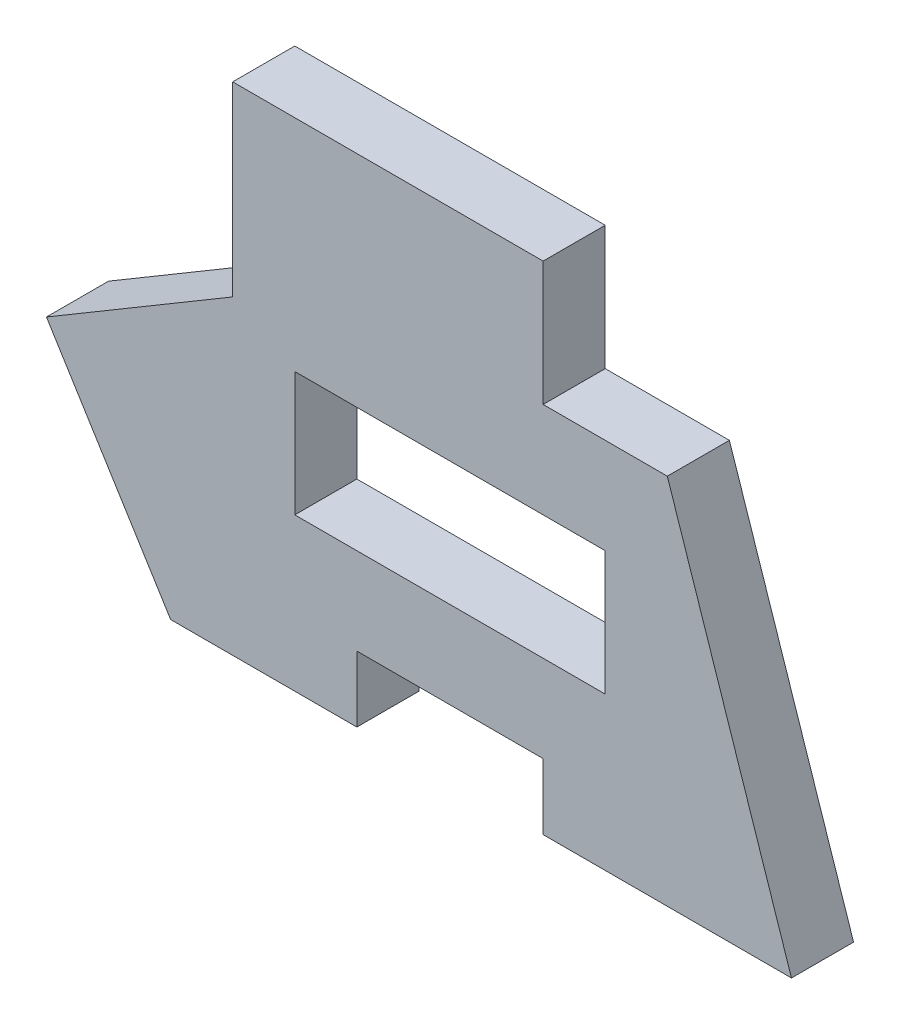
ISO-10303-21;
HEADER;
FILE_DESCRIPTION(('STEP AP214'),'2;1');
FILE_NAME('part.step','',(''),(''),'','','');
FILE_SCHEMA(('AUTOMOTIVE_DESIGN { 1 0 10303 214 1 1 1 1 }'));
ENDSEC;
DATA;
#1=APPLICATION_CONTEXT('core data for automotive mechanical design processes');
#2=APPLICATION_PROTOCOL_DEFINITION('international standard','automotive_design',2000,#1);
#3=PRODUCT_CONTEXT('',#1,'mechanical');
#4=PRODUCT('Part','Part','',(#3));
#5=PRODUCT_RELATED_PRODUCT_CATEGORY('part','',(#4));
#6=PRODUCT_DEFINITION_FORMATION('','',#4);
#7=PRODUCT_DEFINITION_CONTEXT('part definition',#1,'design');
#8=PRODUCT_DEFINITION('design','',#6,#7);
#9=PRODUCT_DEFINITION_SHAPE('','',#8);
#10=(LENGTH_UNIT() NAMED_UNIT(*) SI_UNIT(.MILLI.,.METRE.));
#11=(NAMED_UNIT(*) PLANE_ANGLE_UNIT() SI_UNIT($,.RADIAN.));
#12=(NAMED_UNIT(*) SI_UNIT($,.STERADIAN.) SOLID_ANGLE_UNIT());
#13=UNCERTAINTY_MEASURE_WITH_UNIT(LENGTH_MEASURE(1.E-05),#10,'distance_accuracy_value','');
#14=(GEOMETRIC_REPRESENTATION_CONTEXT(3) GLOBAL_UNCERTAINTY_ASSIGNED_CONTEXT((#13)) GLOBAL_UNIT_ASSIGNED_CONTEXT((#10,
#11,#12)) REPRESENTATION_CONTEXT('',''));
#15=CARTESIAN_POINT('',(0.,0.,0.));
#16=DIRECTION('',(0.,0.,1.));
#17=DIRECTION('',(1.,0.,0.));
#18=AXIS2_PLACEMENT_3D('',#15,#16,#17);
#19=CARTESIAN_POINT('',(0.,0.,50.));
#20=DIRECTION('',(0.,0.,-1.));
#21=DIRECTION('',(-1.,0.,0.));
#22=AXIS2_PLACEMENT_3D('',#19,#20,#21);
#23=PLANE('',#22);
#24=DIRECTION('',(-0.316227766016838,0.948683298050514,0.));
#25=VECTOR('',#24,1.);
#26=CARTESIAN_POINT('',(225.,100.330733418876,50.));
#27=LINE('',#26,#25);
#28=CARTESIAN_POINT('',(325.,-199.669266581124,50.));
#29=VERTEX_POINT('',#28);
#30=CARTESIAN_POINT('',(225.,100.330733418876,50.));
#31=VERTEX_POINT('',#30);
#32=EDGE_CURVE('E182',#29,#31,#27,.T.);
#33=ORIENTED_EDGE('',*,*,#32,.T.);
#34=DIRECTION('',(-1.,0.,0.));
#35=VECTOR('',#34,1.);
#36=CARTESIAN_POINT('',(125.,100.330733418876,50.));
#37=LINE('',#36,#35);
#38=CARTESIAN_POINT('',(125.,100.330733418876,50.));
#39=VERTEX_POINT('',#38);
#40=EDGE_CURVE('E185',#31,#39,#37,.T.);
#41=ORIENTED_EDGE('',*,*,#40,.T.);
#42=DIRECTION('',(0.,1.,0.));
#43=VECTOR('',#42,1.);
#44=CARTESIAN_POINT('',(125.,100.330733418876,50.));
#45=LINE('',#44,#43);
#46=CARTESIAN_POINT('',(125.,200.330733418876,50.));
#47=VERTEX_POINT('',#46);
#48=EDGE_CURVE('E188',#39,#47,#45,.T.);
#49=ORIENTED_EDGE('',*,*,#48,.T.);
#50=DIRECTION('',(-1.,0.,0.));
#51=VECTOR('',#50,1.);
#52=CARTESIAN_POINT('',(-125.,200.330733418876,50.));
#53=LINE('',#52,#51);
#54=CARTESIAN_POINT('',(-125.,200.330733418876,50.));
#55=VERTEX_POINT('',#54);
#56=EDGE_CURVE('E190',#47,#55,#53,.T.);
#57=ORIENTED_EDGE('',*,*,#56,.T.);
#58=DIRECTION('',(0.,-1.,0.));
#59=VECTOR('',#58,1.);
#60=CARTESIAN_POINT('',(-125.,200.330733418876,50.));
#61=LINE('',#60,#59);
#62=CARTESIAN_POINT('',(-125.,50.3307334188764,50.));
#63=VERTEX_POINT('',#62);
#64=EDGE_CURVE('E192',#55,#63,#61,.T.);
#65=ORIENTED_EDGE('',*,*,#64,.T.);
#66=DIRECTION('',(-0.860012009673785,-0.510273792406446,0.));
#67=VECTOR('',#66,1.);
#68=CARTESIAN_POINT('',(-125.,50.3307334188764,50.));
#69=LINE('',#68,#67);
#70=CARTESIAN_POINT('',(-275.,-38.6692665811236,50.));
#71=VERTEX_POINT('',#70);
#72=EDGE_CURVE('E194',#63,#71,#69,.T.);
#73=ORIENTED_EDGE('',*,*,#72,.T.);
#74=DIRECTION('',(0.527625517089336,-0.849477082513831,0.));
#75=VECTOR('',#74,1.);
#76=CARTESIAN_POINT('',(-275.,-38.6692665811236,50.));
#77=LINE('',#76,#75);
#78=CARTESIAN_POINT('',(-175.,-199.669266581124,50.));
#79=VERTEX_POINT('',#78);
#80=EDGE_CURVE('E196',#71,#79,#77,.T.);
#81=ORIENTED_EDGE('',*,*,#80,.T.);
#82=DIRECTION('',(1.,0.,0.));
#83=VECTOR('',#82,1.);
#84=CARTESIAN_POINT('',(-175.,-199.669266581124,50.));
#85=LINE('',#84,#83);
#86=CARTESIAN_POINT('',(-25.0000000000002,-199.669266581124,50.));
#87=VERTEX_POINT('',#86);
#88=EDGE_CURVE('E198',#79,#87,#85,.T.);
#89=ORIENTED_EDGE('',*,*,#88,.T.);
#90=DIRECTION('',(0.,1.,0.));
#91=VECTOR('',#90,1.);
#92=CARTESIAN_POINT('',(-25.0000000000002,-199.669266581124,50.));
#93=LINE('',#92,#91);
#94=CARTESIAN_POINT('',(-25.0000000000002,-146.669266581124,50.));
#95=VERTEX_POINT('',#94);
#96=EDGE_CURVE('E200',#87,#95,#93,.T.);
#97=ORIENTED_EDGE('',*,*,#96,.T.);
#98=DIRECTION('',(1.,0.,0.));
#99=VECTOR('',#98,1.);
#100=CARTESIAN_POINT('',(-25.0000000000002,-146.669266581124,50.));
#101=LINE('',#100,#99);
#102=CARTESIAN_POINT('',(125.,-146.669266581124,50.));
#103=VERTEX_POINT('',#102);
#104=EDGE_CURVE('E202',#95,#103,#101,.T.);
#105=ORIENTED_EDGE('',*,*,#104,.T.);
#106=DIRECTION('',(0.,-1.,0.));
#107=VECTOR('',#106,1.);
#108=CARTESIAN_POINT('',(125.,-146.669266581124,50.));
#109=LINE('',#108,#107);
#110=CARTESIAN_POINT('',(125.,-199.669266581124,50.));
#111=VERTEX_POINT('',#110);
#112=EDGE_CURVE('E204',#103,#111,#109,.T.);
#113=ORIENTED_EDGE('',*,*,#112,.T.);
#114=DIRECTION('',(1.,0.,0.));
#115=VECTOR('',#114,1.);
#116=CARTESIAN_POINT('',(125.,-199.669266581124,50.));
#117=LINE('',#116,#115);
#118=EDGE_CURVE('E206',#111,#29,#117,.T.);
#119=ORIENTED_EDGE('',*,*,#118,.T.);
#120=EDGE_LOOP('',(#33,#41,#49,#57,#65,#73,#81,#89,#97,#105,#113,#119));
#121=FACE_BOUND('',#120,.T.);
#122=DIRECTION('',(0.,-1.,0.));
#123=VECTOR('',#122,1.);
#124=CARTESIAN_POINT('',(-75.0000000000003,23.3307334188764,50.));
#125=LINE('',#124,#123);
#126=CARTESIAN_POINT('',(-75.0000000000003,23.3307334188764,50.));
#127=VERTEX_POINT('',#126);
#128=CARTESIAN_POINT('',(-75.0000000000002,-76.6692665811236,50.));
#129=VERTEX_POINT('',#128);
#130=EDGE_CURVE('E146',#127,#129,#125,.T.);
#131=ORIENTED_EDGE('',*,*,#130,.F.);
#132=DIRECTION('',(-1.,0.,0.));
#133=VECTOR('',#132,1.);
#134=CARTESIAN_POINT('',(-75.0000000000003,23.3307334188764,50.));
#135=LINE('',#134,#133);
#136=CARTESIAN_POINT('',(175.,23.3307334188764,50.));
#137=VERTEX_POINT('',#136);
#138=EDGE_CURVE('E168',#137,#127,#135,.T.);
#139=ORIENTED_EDGE('',*,*,#138,.F.);
#140=DIRECTION('',(0.,1.,0.));
#141=VECTOR('',#140,1.);
#142=CARTESIAN_POINT('',(175.,23.3307334188764,50.));
#143=LINE('',#142,#141);
#144=CARTESIAN_POINT('',(175.,-76.6692665811236,50.));
#145=VERTEX_POINT('',#144);
#146=EDGE_CURVE('E166',#145,#137,#143,.T.);
#147=ORIENTED_EDGE('',*,*,#146,.F.);
#148=DIRECTION('',(1.,0.,0.));
#149=VECTOR('',#148,1.);
#150=CARTESIAN_POINT('',(-75.0000000000002,-76.6692665811236,50.));
#151=LINE('',#150,#149);
#152=EDGE_CURVE('E154',#129,#145,#151,.T.);
#153=ORIENTED_EDGE('',*,*,#152,.F.);
#154=EDGE_LOOP('',(#131,#139,#147,#153));
#155=FACE_BOUND('',#154,.T.);
#156=ADVANCED_FACE('F33',(#121,#155),#23,.F.);
#157=CARTESIAN_POINT('',(0.,0.,0.));
#158=DIRECTION('',(0.,0.,-1.));
#159=DIRECTION('',(-1.,0.,0.));
#160=AXIS2_PLACEMENT_3D('',#157,#158,#159);
#161=PLANE('',#160);
#162=DIRECTION('',(-0.316227766016838,0.948683298050514,0.));
#163=VECTOR('',#162,1.);
#164=CARTESIAN_POINT('',(225.,100.330733418876,0.));
#165=LINE('',#164,#163);
#166=CARTESIAN_POINT('',(325.,-199.669266581124,0.));
#167=VERTEX_POINT('',#166);
#168=CARTESIAN_POINT('',(225.,100.330733418876,0.));
#169=VERTEX_POINT('',#168);
#170=EDGE_CURVE('E162',#167,#169,#165,.T.);
#171=ORIENTED_EDGE('',*,*,#170,.F.);
#172=DIRECTION('',(1.,0.,0.));
#173=VECTOR('',#172,1.);
#174=CARTESIAN_POINT('',(125.,-199.669266581124,0.));
#175=LINE('',#174,#173);
#176=CARTESIAN_POINT('',(125.,-199.669266581124,0.));
#177=VERTEX_POINT('',#176);
#178=EDGE_CURVE('E186',#177,#167,#175,.T.);
#179=ORIENTED_EDGE('',*,*,#178,.F.);
#180=DIRECTION('',(0.,-1.,0.));
#181=VECTOR('',#180,1.);
#182=CARTESIAN_POINT('',(125.,-146.669266581124,0.));
#183=LINE('',#182,#181);
#184=CARTESIAN_POINT('',(125.,-146.669266581124,0.));
#185=VERTEX_POINT('',#184);
#186=EDGE_CURVE('E229',#185,#177,#183,.T.);
#187=ORIENTED_EDGE('',*,*,#186,.F.);
#188=DIRECTION('',(1.,0.,0.));
#189=VECTOR('',#188,1.);
#190=CARTESIAN_POINT('',(-25.0000000000002,-146.669266581124,0.));
#191=LINE('',#190,#189);
#192=CARTESIAN_POINT('',(-25.0000000000002,-146.669266581124,0.));
#193=VERTEX_POINT('',#192);
#194=EDGE_CURVE('E227',#193,#185,#191,.T.);
#195=ORIENTED_EDGE('',*,*,#194,.F.);
#196=DIRECTION('',(0.,1.,0.));
#197=VECTOR('',#196,1.);
#198=CARTESIAN_POINT('',(-25.0000000000002,-199.669266581124,0.));
#199=LINE('',#198,#197);
#200=CARTESIAN_POINT('',(-25.0000000000002,-199.669266581124,0.));
#201=VERTEX_POINT('',#200);
#202=EDGE_CURVE('E225',#201,#193,#199,.T.);
#203=ORIENTED_EDGE('',*,*,#202,.F.);
#204=DIRECTION('',(1.,0.,0.));
#205=VECTOR('',#204,1.);
#206=CARTESIAN_POINT('',(-175.,-199.669266581124,0.));
#207=LINE('',#206,#205);
#208=CARTESIAN_POINT('',(-175.,-199.669266581124,0.));
#209=VERTEX_POINT('',#208);
#210=EDGE_CURVE('E223',#209,#201,#207,.T.);
#211=ORIENTED_EDGE('',*,*,#210,.F.);
#212=DIRECTION('',(0.527625517089336,-0.849477082513831,0.));
#213=VECTOR('',#212,1.);
#214=CARTESIAN_POINT('',(-275.,-38.6692665811236,0.));
#215=LINE('',#214,#213);
#216=CARTESIAN_POINT('',(-275.,-38.6692665811236,0.));
#217=VERTEX_POINT('',#216);
#218=EDGE_CURVE('E221',#217,#209,#215,.T.);
#219=ORIENTED_EDGE('',*,*,#218,.F.);
#220=DIRECTION('',(-0.860012009673785,-0.510273792406446,0.));
#221=VECTOR('',#220,1.);
#222=CARTESIAN_POINT('',(-125.,50.3307334188764,0.));
#223=LINE('',#222,#221);
#224=CARTESIAN_POINT('',(-125.,50.3307334188764,0.));
#225=VERTEX_POINT('',#224);
#226=EDGE_CURVE('E219',#225,#217,#223,.T.);
#227=ORIENTED_EDGE('',*,*,#226,.F.);
#228=DIRECTION('',(0.,-1.,0.));
#229=VECTOR('',#228,1.);
#230=CARTESIAN_POINT('',(-125.,200.330733418876,0.));
#231=LINE('',#230,#229);
#232=CARTESIAN_POINT('',(-125.,200.330733418876,0.));
#233=VERTEX_POINT('',#232);
#234=EDGE_CURVE('E217',#233,#225,#231,.T.);
#235=ORIENTED_EDGE('',*,*,#234,.F.);
#236=DIRECTION('',(-1.,0.,0.));
#237=VECTOR('',#236,1.);
#238=CARTESIAN_POINT('',(-125.,200.330733418876,0.));
#239=LINE('',#238,#237);
#240=CARTESIAN_POINT('',(125.,200.330733418876,0.));
#241=VERTEX_POINT('',#240);
#242=EDGE_CURVE('E215',#241,#233,#239,.T.);
#243=ORIENTED_EDGE('',*,*,#242,.F.);
#244=DIRECTION('',(0.,1.,0.));
#245=VECTOR('',#244,1.);
#246=CARTESIAN_POINT('',(125.,100.330733418876,0.));
#247=LINE('',#246,#245);
#248=CARTESIAN_POINT('',(125.,100.330733418876,0.));
#249=VERTEX_POINT('',#248);
#250=EDGE_CURVE('E213',#249,#241,#247,.T.);
#251=ORIENTED_EDGE('',*,*,#250,.F.);
#252=DIRECTION('',(-1.,0.,0.));
#253=VECTOR('',#252,1.);
#254=CARTESIAN_POINT('',(125.,100.330733418876,0.));
#255=LINE('',#254,#253);
#256=EDGE_CURVE('E211',#169,#249,#255,.T.);
#257=ORIENTED_EDGE('',*,*,#256,.F.);
#258=EDGE_LOOP('',(#171,#179,#187,#195,#203,#211,#219,#227,#235,#243,#251,#257));
#259=FACE_BOUND('',#258,.T.);
#260=DIRECTION('',(-1.,0.,0.));
#261=VECTOR('',#260,1.);
#262=CARTESIAN_POINT('',(-75.0000000000003,23.3307334188764,0.));
#263=LINE('',#262,#261);
#264=CARTESIAN_POINT('',(175.,23.3307334188764,0.));
#265=VERTEX_POINT('',#264);
#266=CARTESIAN_POINT('',(-75.0000000000003,23.3307334188764,0.));
#267=VERTEX_POINT('',#266);
#268=EDGE_CURVE('E155',#265,#267,#263,.T.);
#269=ORIENTED_EDGE('',*,*,#268,.T.);
#270=DIRECTION('',(0.,-1.,0.));
#271=VECTOR('',#270,1.);
#272=CARTESIAN_POINT('',(-75.0000000000003,23.3307334188764,0.));
#273=LINE('',#272,#271);
#274=CARTESIAN_POINT('',(-75.0000000000002,-76.6692665811236,0.));
#275=VERTEX_POINT('',#274);
#276=EDGE_CURVE('E56',#267,#275,#273,.T.);
#277=ORIENTED_EDGE('',*,*,#276,.T.);
#278=DIRECTION('',(1.,0.,0.));
#279=VECTOR('',#278,1.);
#280=CARTESIAN_POINT('',(-75.0000000000002,-76.6692665811236,0.));
#281=LINE('',#280,#279);
#282=CARTESIAN_POINT('',(175.,-76.6692665811236,0.));
#283=VERTEX_POINT('',#282);
#284=EDGE_CURVE('E161',#275,#283,#281,.T.);
#285=ORIENTED_EDGE('',*,*,#284,.T.);
#286=DIRECTION('',(0.,1.,0.));
#287=VECTOR('',#286,1.);
#288=CARTESIAN_POINT('',(175.,23.3307334188764,0.));
#289=LINE('',#288,#287);
#290=EDGE_CURVE('E174',#283,#265,#289,.T.);
#291=ORIENTED_EDGE('',*,*,#290,.T.);
#292=EDGE_LOOP('',(#269,#277,#285,#291));
#293=FACE_BOUND('',#292,.T.);
#294=ADVANCED_FACE('F271',(#259,#293),#161,.T.);
#295=CARTESIAN_POINT('',(225.,100.330733418876,50.));
#296=DIRECTION('',(-0.948683298050514,-0.316227766016838,0.));
#297=DIRECTION('',(0.316227766016838,-0.948683298050514,0.));
#298=AXIS2_PLACEMENT_3D('',#295,#296,#297);
#299=PLANE('',#298);
#300=ORIENTED_EDGE('',*,*,#170,.T.);
#301=DIRECTION('',(0.,0.,-1.));
#302=VECTOR('',#301,1.);
#303=CARTESIAN_POINT('',(225.,100.330733418876,50.));
#304=LINE('',#303,#302);
#305=EDGE_CURVE('E11',#31,#169,#304,.T.);
#306=ORIENTED_EDGE('',*,*,#305,.F.);
#307=ORIENTED_EDGE('',*,*,#32,.F.);
#308=DIRECTION('',(0.,0.,-1.));
#309=VECTOR('',#308,1.);
#310=CARTESIAN_POINT('',(325.,-199.669266581124,50.));
#311=LINE('',#310,#309);
#312=EDGE_CURVE('E208',#29,#167,#311,.T.);
#313=ORIENTED_EDGE('',*,*,#312,.T.);
#314=EDGE_LOOP('',(#300,#306,#307,#313));
#315=FACE_BOUND('',#314,.T.);
#316=ADVANCED_FACE('F35',(#315),#299,.F.);
#317=CARTESIAN_POINT('',(125.,100.330733418876,50.));
#318=DIRECTION('',(0.,-1.,0.));
#319=DIRECTION('',(0.,0.,-1.));
#320=AXIS2_PLACEMENT_3D('',#317,#318,#319);
#321=PLANE('',#320);
#322=ORIENTED_EDGE('',*,*,#256,.T.);
#323=DIRECTION('',(0.,0.,-1.));
#324=VECTOR('',#323,1.);
#325=CARTESIAN_POINT('',(125.,100.330733418876,50.));
#326=LINE('',#325,#324);
#327=EDGE_CURVE('E41',#39,#249,#326,.T.);
#328=ORIENTED_EDGE('',*,*,#327,.F.);
#329=ORIENTED_EDGE('',*,*,#40,.F.);
#330=ORIENTED_EDGE('',*,*,#305,.T.);
#331=EDGE_LOOP('',(#322,#328,#329,#330));
#332=FACE_BOUND('',#331,.T.);
#333=ADVANCED_FACE('F288',(#332),#321,.F.);
#334=CARTESIAN_POINT('',(125.,100.330733418876,50.));
#335=DIRECTION('',(-1.,0.,0.));
#336=DIRECTION('',(0.,0.,1.));
#337=AXIS2_PLACEMENT_3D('',#334,#335,#336);
#338=PLANE('',#337);
#339=ORIENTED_EDGE('',*,*,#250,.T.);
#340=DIRECTION('',(0.,0.,-1.));
#341=VECTOR('',#340,1.);
#342=CARTESIAN_POINT('',(125.,200.330733418876,50.));
#343=LINE('',#342,#341);
#344=EDGE_CURVE('E258',#47,#241,#343,.T.);
#345=ORIENTED_EDGE('',*,*,#344,.F.);
#346=ORIENTED_EDGE('',*,*,#48,.F.);
#347=ORIENTED_EDGE('',*,*,#327,.T.);
#348=EDGE_LOOP('',(#339,#345,#346,#347));
#349=FACE_BOUND('',#348,.T.);
#350=ADVANCED_FACE('F265',(#349),#338,.F.);
#351=CARTESIAN_POINT('',(-125.,200.330733418876,50.));
#352=DIRECTION('',(0.,-1.,0.));
#353=DIRECTION('',(1.,0.,0.));
#354=AXIS2_PLACEMENT_3D('',#351,#352,#353);
#355=PLANE('',#354);
#356=ORIENTED_EDGE('',*,*,#242,.T.);
#357=DIRECTION('',(0.,0.,-1.));
#358=VECTOR('',#357,1.);
#359=CARTESIAN_POINT('',(-125.,200.330733418876,50.));
#360=LINE('',#359,#358);
#361=EDGE_CURVE('E255',#55,#233,#360,.T.);
#362=ORIENTED_EDGE('',*,*,#361,.F.);
#363=ORIENTED_EDGE('',*,*,#56,.F.);
#364=ORIENTED_EDGE('',*,*,#344,.T.);
#365=EDGE_LOOP('',(#356,#362,#363,#364));
#366=FACE_BOUND('',#365,.T.);
#367=ADVANCED_FACE('F277',(#366),#355,.F.);
#368=CARTESIAN_POINT('',(-125.,200.330733418876,50.));
#369=DIRECTION('',(1.,0.,0.));
#370=DIRECTION('',(0.,1.,0.));
#371=AXIS2_PLACEMENT_3D('',#368,#369,#370);
#372=PLANE('',#371);
#373=ORIENTED_EDGE('',*,*,#234,.T.);
#374=DIRECTION('',(0.,0.,-1.));
#375=VECTOR('',#374,1.);
#376=CARTESIAN_POINT('',(-125.,50.3307334188764,50.));
#377=LINE('',#376,#375);
#378=EDGE_CURVE('E252',#63,#225,#377,.T.);
#379=ORIENTED_EDGE('',*,*,#378,.F.);
#380=ORIENTED_EDGE('',*,*,#64,.F.);
#381=ORIENTED_EDGE('',*,*,#361,.T.);
#382=EDGE_LOOP('',(#373,#379,#380,#381));
#383=FACE_BOUND('',#382,.T.);
#384=ADVANCED_FACE('F281',(#383),#372,.F.);
#385=CARTESIAN_POINT('',(-125.,50.3307334188764,50.));
#386=DIRECTION('',(0.510273792406446,-0.860012009673786,0.));
#387=DIRECTION('',(0.860012009673786,0.510273792406446,0.));
#388=AXIS2_PLACEMENT_3D('',#385,#386,#387);
#389=PLANE('',#388);
#390=ORIENTED_EDGE('',*,*,#226,.T.);
#391=DIRECTION('',(0.,0.,-1.));
#392=VECTOR('',#391,1.);
#393=CARTESIAN_POINT('',(-275.,-38.6692665811236,50.));
#394=LINE('',#393,#392);
#395=EDGE_CURVE('E249',#71,#217,#394,.T.);
#396=ORIENTED_EDGE('',*,*,#395,.F.);
#397=ORIENTED_EDGE('',*,*,#72,.F.);
#398=ORIENTED_EDGE('',*,*,#378,.T.);
#399=EDGE_LOOP('',(#390,#396,#397,#398));
#400=FACE_BOUND('',#399,.T.);
#401=ADVANCED_FACE('F321',(#400),#389,.F.);
#402=CARTESIAN_POINT('',(-275.,-38.6692665811236,50.));
#403=DIRECTION('',(0.849477082513831,0.527625517089336,0.));
#404=DIRECTION('',(-0.527625517089336,0.849477082513831,0.));
#405=AXIS2_PLACEMENT_3D('',#402,#403,#404);
#406=PLANE('',#405);
#407=ORIENTED_EDGE('',*,*,#218,.T.);
#408=DIRECTION('',(0.,0.,-1.));
#409=VECTOR('',#408,1.);
#410=CARTESIAN_POINT('',(-175.,-199.669266581124,50.));
#411=LINE('',#410,#409);
#412=EDGE_CURVE('E246',#79,#209,#411,.T.);
#413=ORIENTED_EDGE('',*,*,#412,.F.);
#414=ORIENTED_EDGE('',*,*,#80,.F.);
#415=ORIENTED_EDGE('',*,*,#395,.T.);
#416=EDGE_LOOP('',(#407,#413,#414,#415));
#417=FACE_BOUND('',#416,.T.);
#418=ADVANCED_FACE('F319',(#417),#406,.F.);
#419=CARTESIAN_POINT('',(-175.,-199.669266581124,50.));
#420=DIRECTION('',(0.,1.,0.));
#421=DIRECTION('',(-1.,0.,0.));
#422=AXIS2_PLACEMENT_3D('',#419,#420,#421);
#423=PLANE('',#422);
#424=ORIENTED_EDGE('',*,*,#210,.T.);
#425=DIRECTION('',(0.,0.,-1.));
#426=VECTOR('',#425,1.);
#427=CARTESIAN_POINT('',(-25.0000000000002,-199.669266581124,50.));
#428=LINE('',#427,#426);
#429=EDGE_CURVE('E243',#87,#201,#428,.T.);
#430=ORIENTED_EDGE('',*,*,#429,.F.);
#431=ORIENTED_EDGE('',*,*,#88,.F.);
#432=ORIENTED_EDGE('',*,*,#412,.T.);
#433=EDGE_LOOP('',(#424,#430,#431,#432));
#434=FACE_BOUND('',#433,.T.);
#435=ADVANCED_FACE('F315',(#434),#423,.F.);
#436=CARTESIAN_POINT('',(-25.0000000000002,-199.669266581124,50.));
#437=DIRECTION('',(-1.,0.,0.));
#438=DIRECTION('',(0.,0.,1.));
#439=AXIS2_PLACEMENT_3D('',#436,#437,#438);
#440=PLANE('',#439);
#441=ORIENTED_EDGE('',*,*,#202,.T.);
#442=DIRECTION('',(0.,0.,-1.));
#443=VECTOR('',#442,1.);
#444=CARTESIAN_POINT('',(-25.0000000000002,-146.669266581124,50.));
#445=LINE('',#444,#443);
#446=EDGE_CURVE('E240',#95,#193,#445,.T.);
#447=ORIENTED_EDGE('',*,*,#446,.F.);
#448=ORIENTED_EDGE('',*,*,#96,.F.);
#449=ORIENTED_EDGE('',*,*,#429,.T.);
#450=EDGE_LOOP('',(#441,#447,#448,#449));
#451=FACE_BOUND('',#450,.T.);
#452=ADVANCED_FACE('F310',(#451),#440,.F.);
#453=CARTESIAN_POINT('',(-25.0000000000002,-146.669266581124,50.));
#454=DIRECTION('',(0.,1.,0.));
#455=DIRECTION('',(-1.,0.,0.));
#456=AXIS2_PLACEMENT_3D('',#453,#454,#455);
#457=PLANE('',#456);
#458=ORIENTED_EDGE('',*,*,#194,.T.);
#459=DIRECTION('',(0.,0.,-1.));
#460=VECTOR('',#459,1.);
#461=CARTESIAN_POINT('',(125.,-146.669266581124,50.));
#462=LINE('',#461,#460);
#463=EDGE_CURVE('E237',#103,#185,#462,.T.);
#464=ORIENTED_EDGE('',*,*,#463,.F.);
#465=ORIENTED_EDGE('',*,*,#104,.F.);
#466=ORIENTED_EDGE('',*,*,#446,.T.);
#467=EDGE_LOOP('',(#458,#464,#465,#466));
#468=FACE_BOUND('',#467,.T.);
#469=ADVANCED_FACE('F304',(#468),#457,.F.);
#470=CARTESIAN_POINT('',(125.,-146.669266581124,50.));
#471=DIRECTION('',(1.,0.,0.));
#472=DIRECTION('',(0.,0.,-1.));
#473=AXIS2_PLACEMENT_3D('',#470,#471,#472);
#474=PLANE('',#473);
#475=ORIENTED_EDGE('',*,*,#186,.T.);
#476=DIRECTION('',(0.,0.,-1.));
#477=VECTOR('',#476,1.);
#478=CARTESIAN_POINT('',(125.,-199.669266581124,50.));
#479=LINE('',#478,#477);
#480=EDGE_CURVE('E234',#111,#177,#479,.T.);
#481=ORIENTED_EDGE('',*,*,#480,.F.);
#482=ORIENTED_EDGE('',*,*,#112,.F.);
#483=ORIENTED_EDGE('',*,*,#463,.T.);
#484=EDGE_LOOP('',(#475,#481,#482,#483));
#485=FACE_BOUND('',#484,.T.);
#486=ADVANCED_FACE('F300',(#485),#474,.F.);
#487=CARTESIAN_POINT('',(125.,-199.669266581124,50.));
#488=DIRECTION('',(0.,1.,0.));
#489=DIRECTION('',(0.,0.,1.));
#490=AXIS2_PLACEMENT_3D('',#487,#488,#489);
#491=PLANE('',#490);
#492=ORIENTED_EDGE('',*,*,#178,.T.);
#493=ORIENTED_EDGE('',*,*,#312,.F.);
#494=ORIENTED_EDGE('',*,*,#118,.F.);
#495=ORIENTED_EDGE('',*,*,#480,.T.);
#496=EDGE_LOOP('',(#492,#493,#494,#495));
#497=FACE_BOUND('',#496,.T.);
#498=ADVANCED_FACE('F295',(#497),#491,.F.);
#499=CARTESIAN_POINT('',(-75.0000000000003,23.3307334188764,50.));
#500=DIRECTION('',(1.,0.,0.));
#501=DIRECTION('',(0.,1.,0.));
#502=AXIS2_PLACEMENT_3D('',#499,#500,#501);
#503=PLANE('',#502);
#504=ORIENTED_EDGE('',*,*,#276,.F.);
#505=DIRECTION('',(0.,0.,-1.));
#506=VECTOR('',#505,1.);
#507=CARTESIAN_POINT('',(-75.0000000000003,23.3307334188764,50.));
#508=LINE('',#507,#506);
#509=EDGE_CURVE('E150',#127,#267,#508,.T.);
#510=ORIENTED_EDGE('',*,*,#509,.F.);
#511=ORIENTED_EDGE('',*,*,#130,.T.);
#512=DIRECTION('',(0.,0.,-1.));
#513=VECTOR('',#512,1.);
#514=CARTESIAN_POINT('',(-75.0000000000002,-76.6692665811236,50.));
#515=LINE('',#514,#513);
#516=EDGE_CURVE('E149',#129,#275,#515,.T.);
#517=ORIENTED_EDGE('',*,*,#516,.T.);
#518=EDGE_LOOP('',(#504,#510,#511,#517));
#519=FACE_BOUND('',#518,.T.);
#520=ADVANCED_FACE('F148',(#519),#503,.T.);
#521=CARTESIAN_POINT('',(-75.0000000000002,-76.6692665811236,50.));
#522=DIRECTION('',(0.,1.,0.));
#523=DIRECTION('',(0.,0.,1.));
#524=AXIS2_PLACEMENT_3D('',#521,#522,#523);
#525=PLANE('',#524);
#526=ORIENTED_EDGE('',*,*,#284,.F.);
#527=ORIENTED_EDGE('',*,*,#516,.F.);
#528=ORIENTED_EDGE('',*,*,#152,.T.);
#529=DIRECTION('',(0.,0.,-1.));
#530=VECTOR('',#529,1.);
#531=CARTESIAN_POINT('',(175.,-76.6692665811236,50.));
#532=LINE('',#531,#530);
#533=EDGE_CURVE('E163',#145,#283,#532,.T.);
#534=ORIENTED_EDGE('',*,*,#533,.T.);
#535=EDGE_LOOP('',(#526,#527,#528,#534));
#536=FACE_BOUND('',#535,.T.);
#537=ADVANCED_FACE('F158',(#536),#525,.T.);
#538=CARTESIAN_POINT('',(175.,23.3307334188764,50.));
#539=DIRECTION('',(-1.,0.,0.));
#540=DIRECTION('',(0.,-1.,0.));
#541=AXIS2_PLACEMENT_3D('',#538,#539,#540);
#542=PLANE('',#541);
#543=ORIENTED_EDGE('',*,*,#290,.F.);
#544=ORIENTED_EDGE('',*,*,#533,.F.);
#545=ORIENTED_EDGE('',*,*,#146,.T.);
#546=DIRECTION('',(0.,0.,-1.));
#547=VECTOR('',#546,1.);
#548=CARTESIAN_POINT('',(175.,23.3307334188764,50.));
#549=LINE('',#548,#547);
#550=EDGE_CURVE('E48',#137,#265,#549,.T.);
#551=ORIENTED_EDGE('',*,*,#550,.T.);
#552=EDGE_LOOP('',(#543,#544,#545,#551));
#553=FACE_BOUND('',#552,.T.);
#554=ADVANCED_FACE('F379',(#553),#542,.T.);
#555=CARTESIAN_POINT('',(-75.0000000000003,23.3307334188764,50.));
#556=DIRECTION('',(0.,-1.,0.));
#557=DIRECTION('',(0.,0.,-1.));
#558=AXIS2_PLACEMENT_3D('',#555,#556,#557);
#559=PLANE('',#558);
#560=ORIENTED_EDGE('',*,*,#268,.F.);
#561=ORIENTED_EDGE('',*,*,#550,.F.);
#562=ORIENTED_EDGE('',*,*,#138,.T.);
#563=ORIENTED_EDGE('',*,*,#509,.T.);
#564=EDGE_LOOP('',(#560,#561,#562,#563));
#565=FACE_BOUND('',#564,.T.);
#566=ADVANCED_FACE('F385',(#565),#559,.T.);
#567=CLOSED_SHELL('',(#156,#294,#316,#333,#350,#367,#384,#401,#418,#435,#452,#469,#486,#498,
#520,#537,#554,#566));
#568=MANIFOLD_SOLID_BREP('B2',#567);
#569=ADVANCED_BREP_SHAPE_REPRESENTATION('',(#18,#568),#14);
#570=SHAPE_DEFINITION_REPRESENTATION(#9,#569);
ENDSEC;
END-ISO-10303-21;
